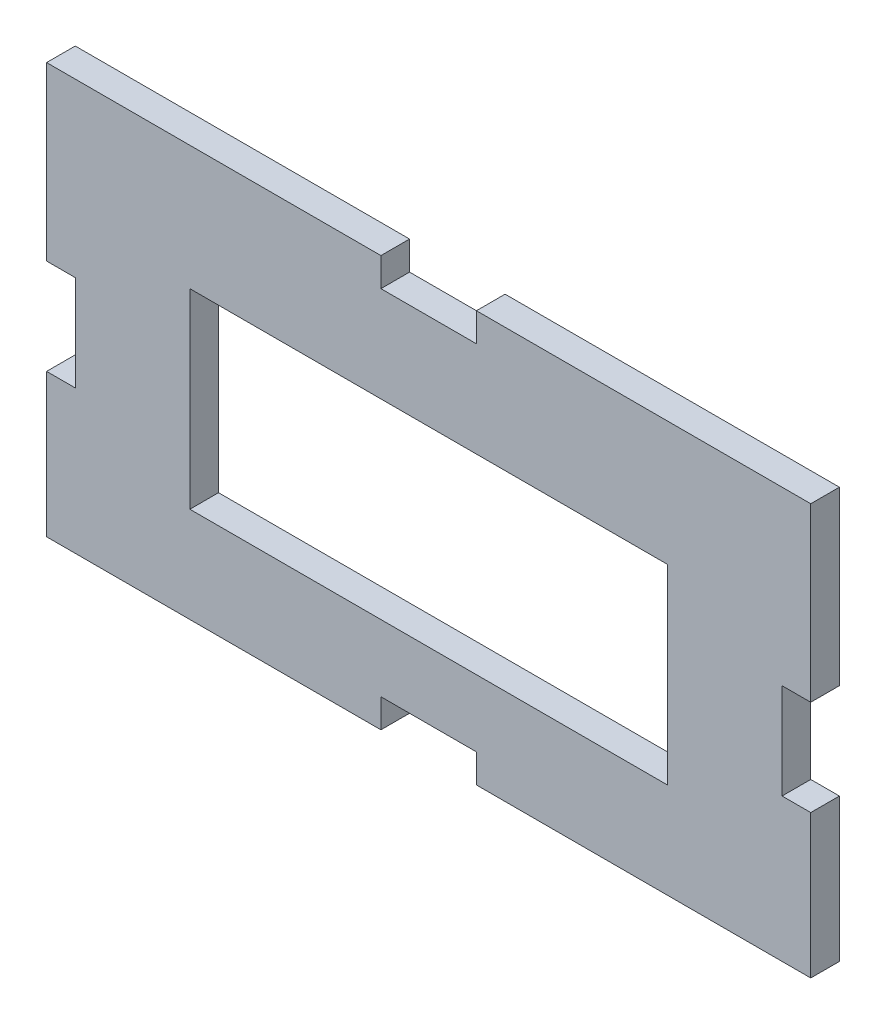
ISO-10303-21;
HEADER;
FILE_DESCRIPTION(('STEP AP214'),'2;1');
FILE_NAME('part.step','',(''),(''),'','','');
FILE_SCHEMA(('AUTOMOTIVE_DESIGN { 1 0 10303 214 1 1 1 1 }'));
ENDSEC;
DATA;
#1=APPLICATION_CONTEXT('core data for automotive mechanical design processes');
#2=APPLICATION_PROTOCOL_DEFINITION('international standard','automotive_design',2000,#1);
#3=PRODUCT_CONTEXT('',#1,'mechanical');
#4=PRODUCT('Part','Part','',(#3));
#5=PRODUCT_RELATED_PRODUCT_CATEGORY('part','',(#4));
#6=PRODUCT_DEFINITION_FORMATION('','',#4);
#7=PRODUCT_DEFINITION_CONTEXT('part definition',#1,'design');
#8=PRODUCT_DEFINITION('design','',#6,#7);
#9=PRODUCT_DEFINITION_SHAPE('','',#8);
#10=(LENGTH_UNIT() NAMED_UNIT(*) SI_UNIT(.MILLI.,.METRE.));
#11=(NAMED_UNIT(*) PLANE_ANGLE_UNIT() SI_UNIT($,.RADIAN.));
#12=(NAMED_UNIT(*) SI_UNIT($,.STERADIAN.) SOLID_ANGLE_UNIT());
#13=UNCERTAINTY_MEASURE_WITH_UNIT(LENGTH_MEASURE(1.E-05),#10,'distance_accuracy_value','');
#14=(GEOMETRIC_REPRESENTATION_CONTEXT(3) GLOBAL_UNCERTAINTY_ASSIGNED_CONTEXT((#13)) GLOBAL_UNIT_ASSIGNED_CONTEXT((#10,
#11,#12)) REPRESENTATION_CONTEXT('',''));
#15=CARTESIAN_POINT('',(0.,0.,0.));
#16=DIRECTION('',(0.,0.,1.));
#17=DIRECTION('',(1.,0.,0.));
#18=AXIS2_PLACEMENT_3D('',#15,#16,#17);
#19=CARTESIAN_POINT('',(-32.6435719058765,-2.13730942666412E-11,3.));
#20=DIRECTION('',(0.,-1.,0.));
#21=DIRECTION('',(0.,0.,-1.));
#22=AXIS2_PLACEMENT_3D('',#19,#20,#21);
#23=PLANE('',#22);
#24=DIRECTION('',(-1.,0.,0.));
#25=VECTOR('',#24,1.);
#26=CARTESIAN_POINT('',(-32.6435719058765,-2.13730942666412E-11,0.));
#27=LINE('',#26,#25);
#28=CARTESIAN_POINT('',(2.35642809412349,-2.13730942666412E-11,0.));
#29=VERTEX_POINT('',#28);
#30=CARTESIAN_POINT('',(-32.6435719058765,-2.13730942666412E-11,0.));
#31=VERTEX_POINT('',#30);
#32=EDGE_CURVE('E222',#29,#31,#27,.T.);
#33=ORIENTED_EDGE('',*,*,#32,.T.);
#34=DIRECTION('',(0.,0.,-1.));
#35=VECTOR('',#34,1.);
#36=CARTESIAN_POINT('',(-32.6435719058765,-2.13730942666412E-11,3.));
#37=LINE('',#36,#35);
#38=CARTESIAN_POINT('',(-32.6435719058765,-2.13730942666412E-11,3.));
#39=VERTEX_POINT('',#38);
#40=EDGE_CURVE('E364',#39,#31,#37,.T.);
#41=ORIENTED_EDGE('',*,*,#40,.F.);
#42=DIRECTION('',(-1.,0.,0.));
#43=VECTOR('',#42,1.);
#44=CARTESIAN_POINT('',(-32.6435719058765,-2.13730942666412E-11,3.));
#45=LINE('',#44,#43);
#46=CARTESIAN_POINT('',(2.35642809412349,-2.13730942666412E-11,3.));
#47=VERTEX_POINT('',#46);
#48=EDGE_CURVE('E225',#47,#39,#45,.T.);
#49=ORIENTED_EDGE('',*,*,#48,.F.);
#50=DIRECTION('',(0.,0.,-1.));
#51=VECTOR('',#50,1.);
#52=CARTESIAN_POINT('',(2.35642809412349,-2.13730942666412E-11,3.));
#53=LINE('',#52,#51);
#54=EDGE_CURVE('E267',#47,#29,#53,.T.);
#55=ORIENTED_EDGE('',*,*,#54,.T.);
#56=EDGE_LOOP('',(#33,#41,#49,#55));
#57=FACE_BOUND('',#56,.T.);
#58=ADVANCED_FACE('F37',(#57),#23,.F.);
#59=CARTESIAN_POINT('',(-32.6435719058765,-2.13730942666412E-11,3.));
#60=DIRECTION('',(1.,0.,0.));
#61=DIRECTION('',(0.,1.,0.));
#62=AXIS2_PLACEMENT_3D('',#59,#60,#61);
#63=PLANE('',#62);
#64=DIRECTION('',(0.,-1.,0.));
#65=VECTOR('',#64,1.);
#66=CARTESIAN_POINT('',(-32.6435719058765,-2.13730942666412E-11,0.));
#67=LINE('',#66,#65);
#68=CARTESIAN_POINT('',(-32.6435719058765,-18.0000000000214,0.));
#69=VERTEX_POINT('',#68);
#70=EDGE_CURVE('E270',#31,#69,#67,.T.);
#71=ORIENTED_EDGE('',*,*,#70,.T.);
#72=DIRECTION('',(0.,0.,-1.));
#73=VECTOR('',#72,1.);
#74=CARTESIAN_POINT('',(-32.6435719058765,-18.0000000000214,3.));
#75=LINE('',#74,#73);
#76=CARTESIAN_POINT('',(-32.6435719058765,-18.0000000000214,3.));
#77=VERTEX_POINT('',#76);
#78=EDGE_CURVE('E361',#77,#69,#75,.T.);
#79=ORIENTED_EDGE('',*,*,#78,.F.);
#80=DIRECTION('',(0.,-1.,0.));
#81=VECTOR('',#80,1.);
#82=CARTESIAN_POINT('',(-32.6435719058765,-2.13730942666412E-11,3.));
#83=LINE('',#82,#81);
#84=EDGE_CURVE('E228',#39,#77,#83,.T.);
#85=ORIENTED_EDGE('',*,*,#84,.F.);
#86=ORIENTED_EDGE('',*,*,#40,.T.);
#87=EDGE_LOOP('',(#71,#79,#85,#86));
#88=FACE_BOUND('',#87,.T.);
#89=ADVANCED_FACE('F390',(#88),#63,.F.);
#90=CARTESIAN_POINT('',(-32.6435719058765,-18.0000000000214,3.));
#91=DIRECTION('',(0.,1.,0.));
#92=DIRECTION('',(0.,0.,1.));
#93=AXIS2_PLACEMENT_3D('',#90,#91,#92);
#94=PLANE('',#93);
#95=DIRECTION('',(1.,0.,0.));
#96=VECTOR('',#95,1.);
#97=CARTESIAN_POINT('',(-32.6435719058765,-18.0000000000214,0.));
#98=LINE('',#97,#96);
#99=CARTESIAN_POINT('',(-29.6435719058765,-18.0000000000214,0.));
#100=VERTEX_POINT('',#99);
#101=EDGE_CURVE('E272',#69,#100,#98,.T.);
#102=ORIENTED_EDGE('',*,*,#101,.T.);
#103=DIRECTION('',(0.,0.,-1.));
#104=VECTOR('',#103,1.);
#105=CARTESIAN_POINT('',(-29.6435719058765,-18.0000000000214,3.));
#106=LINE('',#105,#104);
#107=CARTESIAN_POINT('',(-29.6435719058765,-18.0000000000214,3.));
#108=VERTEX_POINT('',#107);
#109=EDGE_CURVE('E358',#108,#100,#106,.T.);
#110=ORIENTED_EDGE('',*,*,#109,.F.);
#111=DIRECTION('',(1.,0.,0.));
#112=VECTOR('',#111,1.);
#113=CARTESIAN_POINT('',(-32.6435719058765,-18.0000000000214,3.));
#114=LINE('',#113,#112);
#115=EDGE_CURVE('E231',#77,#108,#114,.T.);
#116=ORIENTED_EDGE('',*,*,#115,.F.);
#117=ORIENTED_EDGE('',*,*,#78,.T.);
#118=EDGE_LOOP('',(#102,#110,#116,#117));
#119=FACE_BOUND('',#118,.T.);
#120=ADVANCED_FACE('F395',(#119),#94,.F.);
#121=CARTESIAN_POINT('',(-29.6435719058765,-18.0000000000214,3.));
#122=DIRECTION('',(1.,0.,0.));
#123=DIRECTION('',(0.,0.,-1.));
#124=AXIS2_PLACEMENT_3D('',#121,#122,#123);
#125=PLANE('',#124);
#126=DIRECTION('',(0.,-1.,0.));
#127=VECTOR('',#126,1.);
#128=CARTESIAN_POINT('',(-29.6435719058765,-18.0000000000214,0.));
#129=LINE('',#128,#127);
#130=CARTESIAN_POINT('',(-29.6435719058765,-28.0000000000214,0.));
#131=VERTEX_POINT('',#130);
#132=EDGE_CURVE('E274',#100,#131,#129,.T.);
#133=ORIENTED_EDGE('',*,*,#132,.T.);
#134=DIRECTION('',(0.,0.,-1.));
#135=VECTOR('',#134,1.);
#136=CARTESIAN_POINT('',(-29.6435719058765,-28.0000000000214,3.));
#137=LINE('',#136,#135);
#138=CARTESIAN_POINT('',(-29.6435719058765,-28.0000000000214,3.));
#139=VERTEX_POINT('',#138);
#140=EDGE_CURVE('E355',#139,#131,#137,.T.);
#141=ORIENTED_EDGE('',*,*,#140,.F.);
#142=DIRECTION('',(0.,-1.,0.));
#143=VECTOR('',#142,1.);
#144=CARTESIAN_POINT('',(-29.6435719058765,-18.0000000000214,3.));
#145=LINE('',#144,#143);
#146=EDGE_CURVE('E233',#108,#139,#145,.T.);
#147=ORIENTED_EDGE('',*,*,#146,.F.);
#148=ORIENTED_EDGE('',*,*,#109,.T.);
#149=EDGE_LOOP('',(#133,#141,#147,#148));
#150=FACE_BOUND('',#149,.T.);
#151=ADVANCED_FACE('F485',(#150),#125,.F.);
#152=CARTESIAN_POINT('',(-29.6435719058765,-28.0000000000214,3.));
#153=DIRECTION('',(0.,-1.,0.));
#154=DIRECTION('',(0.,0.,-1.));
#155=AXIS2_PLACEMENT_3D('',#152,#153,#154);
#156=PLANE('',#155);
#157=DIRECTION('',(-1.,0.,0.));
#158=VECTOR('',#157,1.);
#159=CARTESIAN_POINT('',(-29.6435719058765,-28.0000000000214,0.));
#160=LINE('',#159,#158);
#161=CARTESIAN_POINT('',(-32.6435719058765,-28.0000000000214,0.));
#162=VERTEX_POINT('',#161);
#163=EDGE_CURVE('E276',#131,#162,#160,.T.);
#164=ORIENTED_EDGE('',*,*,#163,.T.);
#165=DIRECTION('',(0.,0.,-1.));
#166=VECTOR('',#165,1.);
#167=CARTESIAN_POINT('',(-32.6435719058765,-28.0000000000214,3.));
#168=LINE('',#167,#166);
#169=CARTESIAN_POINT('',(-32.6435719058765,-28.0000000000214,3.));
#170=VERTEX_POINT('',#169);
#171=EDGE_CURVE('E352',#170,#162,#168,.T.);
#172=ORIENTED_EDGE('',*,*,#171,.F.);
#173=DIRECTION('',(-1.,0.,0.));
#174=VECTOR('',#173,1.);
#175=CARTESIAN_POINT('',(-29.6435719058765,-28.0000000000214,3.));
#176=LINE('',#175,#174);
#177=EDGE_CURVE('E235',#139,#170,#176,.T.);
#178=ORIENTED_EDGE('',*,*,#177,.F.);
#179=ORIENTED_EDGE('',*,*,#140,.T.);
#180=EDGE_LOOP('',(#164,#172,#178,#179));
#181=FACE_BOUND('',#180,.T.);
#182=ADVANCED_FACE('F482',(#181),#156,.F.);
#183=CARTESIAN_POINT('',(-32.6435719058765,-28.0000000000214,3.));
#184=DIRECTION('',(1.,0.,0.));
#185=DIRECTION('',(0.,0.,-1.));
#186=AXIS2_PLACEMENT_3D('',#183,#184,#185);
#187=PLANE('',#186);
#188=DIRECTION('',(0.,-1.,0.));
#189=VECTOR('',#188,1.);
#190=CARTESIAN_POINT('',(-32.6435719058765,-28.0000000000214,0.));
#191=LINE('',#190,#189);
#192=CARTESIAN_POINT('',(-32.6435719058765,-43.0000000000214,0.));
#193=VERTEX_POINT('',#192);
#194=EDGE_CURVE('E278',#162,#193,#191,.T.);
#195=ORIENTED_EDGE('',*,*,#194,.T.);
#196=DIRECTION('',(0.,0.,-1.));
#197=VECTOR('',#196,1.);
#198=CARTESIAN_POINT('',(-32.6435719058765,-43.0000000000214,3.));
#199=LINE('',#198,#197);
#200=CARTESIAN_POINT('',(-32.6435719058765,-43.0000000000214,3.));
#201=VERTEX_POINT('',#200);
#202=EDGE_CURVE('E349',#201,#193,#199,.T.);
#203=ORIENTED_EDGE('',*,*,#202,.F.);
#204=DIRECTION('',(0.,-1.,0.));
#205=VECTOR('',#204,1.);
#206=CARTESIAN_POINT('',(-32.6435719058765,-28.0000000000214,3.));
#207=LINE('',#206,#205);
#208=EDGE_CURVE('E237',#170,#201,#207,.T.);
#209=ORIENTED_EDGE('',*,*,#208,.F.);
#210=ORIENTED_EDGE('',*,*,#171,.T.);
#211=EDGE_LOOP('',(#195,#203,#209,#210));
#212=FACE_BOUND('',#211,.T.);
#213=ADVANCED_FACE('F478',(#212),#187,.F.);
#214=CARTESIAN_POINT('',(-32.6435719058765,-43.0000000000214,3.));
#215=DIRECTION('',(0.,1.,0.));
#216=DIRECTION('',(0.,0.,1.));
#217=AXIS2_PLACEMENT_3D('',#214,#215,#216);
#218=PLANE('',#217);
#219=DIRECTION('',(1.,0.,0.));
#220=VECTOR('',#219,1.);
#221=CARTESIAN_POINT('',(-32.6435719058765,-43.0000000000214,0.));
#222=LINE('',#221,#220);
#223=CARTESIAN_POINT('',(2.35642809412349,-43.0000000000214,0.));
#224=VERTEX_POINT('',#223);
#225=EDGE_CURVE('E280',#193,#224,#222,.T.);
#226=ORIENTED_EDGE('',*,*,#225,.T.);
#227=DIRECTION('',(0.,0.,-1.));
#228=VECTOR('',#227,1.);
#229=CARTESIAN_POINT('',(2.35642809412349,-43.0000000000214,3.));
#230=LINE('',#229,#228);
#231=CARTESIAN_POINT('',(2.35642809412349,-43.0000000000214,3.));
#232=VERTEX_POINT('',#231);
#233=EDGE_CURVE('E346',#232,#224,#230,.T.);
#234=ORIENTED_EDGE('',*,*,#233,.F.);
#235=DIRECTION('',(1.,0.,0.));
#236=VECTOR('',#235,1.);
#237=CARTESIAN_POINT('',(-32.6435719058765,-43.0000000000214,3.));
#238=LINE('',#237,#236);
#239=EDGE_CURVE('E239',#201,#232,#238,.T.);
#240=ORIENTED_EDGE('',*,*,#239,.F.);
#241=ORIENTED_EDGE('',*,*,#202,.T.);
#242=EDGE_LOOP('',(#226,#234,#240,#241));
#243=FACE_BOUND('',#242,.T.);
#244=ADVANCED_FACE('F473',(#243),#218,.F.);
#245=CARTESIAN_POINT('',(2.35642809412349,-43.0000000000214,3.));
#246=DIRECTION('',(-1.,0.,0.));
#247=DIRECTION('',(0.,-1.,0.));
#248=AXIS2_PLACEMENT_3D('',#245,#246,#247);
#249=PLANE('',#248);
#250=DIRECTION('',(0.,1.,0.));
#251=VECTOR('',#250,1.);
#252=CARTESIAN_POINT('',(2.35642809412349,-43.0000000000214,0.));
#253=LINE('',#252,#251);
#254=CARTESIAN_POINT('',(2.35642809412349,-40.0000000000214,0.));
#255=VERTEX_POINT('',#254);
#256=EDGE_CURVE('E282',#224,#255,#253,.T.);
#257=ORIENTED_EDGE('',*,*,#256,.T.);
#258=DIRECTION('',(0.,0.,-1.));
#259=VECTOR('',#258,1.);
#260=CARTESIAN_POINT('',(2.35642809412349,-40.0000000000214,3.));
#261=LINE('',#260,#259);
#262=CARTESIAN_POINT('',(2.35642809412349,-40.0000000000214,3.));
#263=VERTEX_POINT('',#262);
#264=EDGE_CURVE('E343',#263,#255,#261,.T.);
#265=ORIENTED_EDGE('',*,*,#264,.F.);
#266=DIRECTION('',(0.,1.,0.));
#267=VECTOR('',#266,1.);
#268=CARTESIAN_POINT('',(2.35642809412349,-43.0000000000214,3.));
#269=LINE('',#268,#267);
#270=EDGE_CURVE('E241',#232,#263,#269,.T.);
#271=ORIENTED_EDGE('',*,*,#270,.F.);
#272=ORIENTED_EDGE('',*,*,#233,.T.);
#273=EDGE_LOOP('',(#257,#265,#271,#272));
#274=FACE_BOUND('',#273,.T.);
#275=ADVANCED_FACE('F467',(#274),#249,.F.);
#276=CARTESIAN_POINT('',(2.35642809412349,-40.0000000000214,3.));
#277=DIRECTION('',(0.,1.,0.));
#278=DIRECTION('',(0.,0.,1.));
#279=AXIS2_PLACEMENT_3D('',#276,#277,#278);
#280=PLANE('',#279);
#281=DIRECTION('',(1.,0.,0.));
#282=VECTOR('',#281,1.);
#283=CARTESIAN_POINT('',(2.35642809412349,-40.0000000000214,0.));
#284=LINE('',#283,#282);
#285=CARTESIAN_POINT('',(12.3564280941235,-40.0000000000214,0.));
#286=VERTEX_POINT('',#285);
#287=EDGE_CURVE('E284',#255,#286,#284,.T.);
#288=ORIENTED_EDGE('',*,*,#287,.T.);
#289=DIRECTION('',(0.,0.,-1.));
#290=VECTOR('',#289,1.);
#291=CARTESIAN_POINT('',(12.3564280941235,-40.0000000000214,3.));
#292=LINE('',#291,#290);
#293=CARTESIAN_POINT('',(12.3564280941235,-40.0000000000214,3.));
#294=VERTEX_POINT('',#293);
#295=EDGE_CURVE('E340',#294,#286,#292,.T.);
#296=ORIENTED_EDGE('',*,*,#295,.F.);
#297=DIRECTION('',(1.,0.,0.));
#298=VECTOR('',#297,1.);
#299=CARTESIAN_POINT('',(2.35642809412349,-40.0000000000214,3.));
#300=LINE('',#299,#298);
#301=EDGE_CURVE('E243',#263,#294,#300,.T.);
#302=ORIENTED_EDGE('',*,*,#301,.F.);
#303=ORIENTED_EDGE('',*,*,#264,.T.);
#304=EDGE_LOOP('',(#288,#296,#302,#303));
#305=FACE_BOUND('',#304,.T.);
#306=ADVANCED_FACE('F463',(#305),#280,.F.);
#307=CARTESIAN_POINT('',(12.3564280941235,-43.0000000000214,3.));
#308=DIRECTION('',(1.,0.,0.));
#309=DIRECTION('',(0.,1.,0.));
#310=AXIS2_PLACEMENT_3D('',#307,#308,#309);
#311=PLANE('',#310);
#312=DIRECTION('',(0.,-1.,0.));
#313=VECTOR('',#312,1.);
#314=CARTESIAN_POINT('',(12.3564280941235,-43.0000000000214,0.));
#315=LINE('',#314,#313);
#316=CARTESIAN_POINT('',(12.3564280941235,-43.0000000000214,0.));
#317=VERTEX_POINT('',#316);
#318=EDGE_CURVE('E286',#286,#317,#315,.T.);
#319=ORIENTED_EDGE('',*,*,#318,.T.);
#320=DIRECTION('',(0.,0.,-1.));
#321=VECTOR('',#320,1.);
#322=CARTESIAN_POINT('',(12.3564280941235,-43.0000000000214,3.));
#323=LINE('',#322,#321);
#324=CARTESIAN_POINT('',(12.3564280941235,-43.0000000000214,3.));
#325=VERTEX_POINT('',#324);
#326=EDGE_CURVE('E337',#325,#317,#323,.T.);
#327=ORIENTED_EDGE('',*,*,#326,.F.);
#328=DIRECTION('',(0.,-1.,0.));
#329=VECTOR('',#328,1.);
#330=CARTESIAN_POINT('',(12.3564280941235,-43.0000000000214,3.));
#331=LINE('',#330,#329);
#332=EDGE_CURVE('E245',#294,#325,#331,.T.);
#333=ORIENTED_EDGE('',*,*,#332,.F.);
#334=ORIENTED_EDGE('',*,*,#295,.T.);
#335=EDGE_LOOP('',(#319,#327,#333,#334));
#336=FACE_BOUND('',#335,.T.);
#337=ADVANCED_FACE('F458',(#336),#311,.F.);
#338=CARTESIAN_POINT('',(12.3564280941235,-43.0000000000214,3.));
#339=DIRECTION('',(0.,1.,0.));
#340=DIRECTION('',(0.,0.,1.));
#341=AXIS2_PLACEMENT_3D('',#338,#339,#340);
#342=PLANE('',#341);
#343=DIRECTION('',(1.,0.,0.));
#344=VECTOR('',#343,1.);
#345=CARTESIAN_POINT('',(12.3564280941235,-43.0000000000214,0.));
#346=LINE('',#345,#344);
#347=CARTESIAN_POINT('',(47.3564280941235,-43.0000000000214,0.));
#348=VERTEX_POINT('',#347);
#349=EDGE_CURVE('E288',#317,#348,#346,.T.);
#350=ORIENTED_EDGE('',*,*,#349,.T.);
#351=DIRECTION('',(0.,0.,-1.));
#352=VECTOR('',#351,1.);
#353=CARTESIAN_POINT('',(47.3564280941235,-43.0000000000214,3.));
#354=LINE('',#353,#352);
#355=CARTESIAN_POINT('',(47.3564280941235,-43.0000000000214,3.));
#356=VERTEX_POINT('',#355);
#357=EDGE_CURVE('E334',#356,#348,#354,.T.);
#358=ORIENTED_EDGE('',*,*,#357,.F.);
#359=DIRECTION('',(1.,0.,0.));
#360=VECTOR('',#359,1.);
#361=CARTESIAN_POINT('',(12.3564280941235,-43.0000000000214,3.));
#362=LINE('',#361,#360);
#363=EDGE_CURVE('E247',#325,#356,#362,.T.);
#364=ORIENTED_EDGE('',*,*,#363,.F.);
#365=ORIENTED_EDGE('',*,*,#326,.T.);
#366=EDGE_LOOP('',(#350,#358,#364,#365));
#367=FACE_BOUND('',#366,.T.);
#368=ADVANCED_FACE('F452',(#367),#342,.F.);
#369=CARTESIAN_POINT('',(47.3564280941235,-43.0000000000214,3.));
#370=DIRECTION('',(-1.,0.,0.));
#371=DIRECTION('',(0.,0.,1.));
#372=AXIS2_PLACEMENT_3D('',#369,#370,#371);
#373=PLANE('',#372);
#374=DIRECTION('',(0.,1.,0.));
#375=VECTOR('',#374,1.);
#376=CARTESIAN_POINT('',(47.3564280941235,-43.0000000000214,0.));
#377=LINE('',#376,#375);
#378=CARTESIAN_POINT('',(47.3564280941235,-28.0000000000214,0.));
#379=VERTEX_POINT('',#378);
#380=EDGE_CURVE('E290',#348,#379,#377,.T.);
#381=ORIENTED_EDGE('',*,*,#380,.T.);
#382=DIRECTION('',(0.,0.,-1.));
#383=VECTOR('',#382,1.);
#384=CARTESIAN_POINT('',(47.3564280941235,-28.0000000000214,3.));
#385=LINE('',#384,#383);
#386=CARTESIAN_POINT('',(47.3564280941235,-28.0000000000214,3.));
#387=VERTEX_POINT('',#386);
#388=EDGE_CURVE('E331',#387,#379,#385,.T.);
#389=ORIENTED_EDGE('',*,*,#388,.F.);
#390=DIRECTION('',(0.,1.,0.));
#391=VECTOR('',#390,1.);
#392=CARTESIAN_POINT('',(47.3564280941235,-43.0000000000214,3.));
#393=LINE('',#392,#391);
#394=EDGE_CURVE('E249',#356,#387,#393,.T.);
#395=ORIENTED_EDGE('',*,*,#394,.F.);
#396=ORIENTED_EDGE('',*,*,#357,.T.);
#397=EDGE_LOOP('',(#381,#389,#395,#396));
#398=FACE_BOUND('',#397,.T.);
#399=ADVANCED_FACE('F448',(#398),#373,.F.);
#400=CARTESIAN_POINT('',(47.3564280941235,-28.0000000000214,3.));
#401=DIRECTION('',(0.,-1.,0.));
#402=DIRECTION('',(0.,0.,-1.));
#403=AXIS2_PLACEMENT_3D('',#400,#401,#402);
#404=PLANE('',#403);
#405=DIRECTION('',(-1.,0.,0.));
#406=VECTOR('',#405,1.);
#407=CARTESIAN_POINT('',(47.3564280941235,-28.0000000000214,0.));
#408=LINE('',#407,#406);
#409=CARTESIAN_POINT('',(44.3564280941235,-28.0000000000214,0.));
#410=VERTEX_POINT('',#409);
#411=EDGE_CURVE('E292',#379,#410,#408,.T.);
#412=ORIENTED_EDGE('',*,*,#411,.T.);
#413=DIRECTION('',(0.,0.,-1.));
#414=VECTOR('',#413,1.);
#415=CARTESIAN_POINT('',(44.3564280941235,-28.0000000000214,3.));
#416=LINE('',#415,#414);
#417=CARTESIAN_POINT('',(44.3564280941235,-28.0000000000214,3.));
#418=VERTEX_POINT('',#417);
#419=EDGE_CURVE('E328',#418,#410,#416,.T.);
#420=ORIENTED_EDGE('',*,*,#419,.F.);
#421=DIRECTION('',(-1.,0.,0.));
#422=VECTOR('',#421,1.);
#423=CARTESIAN_POINT('',(47.3564280941235,-28.0000000000214,3.));
#424=LINE('',#423,#422);
#425=EDGE_CURVE('E251',#387,#418,#424,.T.);
#426=ORIENTED_EDGE('',*,*,#425,.F.);
#427=ORIENTED_EDGE('',*,*,#388,.T.);
#428=EDGE_LOOP('',(#412,#420,#426,#427));
#429=FACE_BOUND('',#428,.T.);
#430=ADVANCED_FACE('F443',(#429),#404,.F.);
#431=CARTESIAN_POINT('',(44.3564280941235,-28.0000000000214,3.));
#432=DIRECTION('',(-1.,0.,0.));
#433=DIRECTION('',(0.,0.,1.));
#434=AXIS2_PLACEMENT_3D('',#431,#432,#433);
#435=PLANE('',#434);
#436=DIRECTION('',(0.,1.,0.));
#437=VECTOR('',#436,1.);
#438=CARTESIAN_POINT('',(44.3564280941235,-28.0000000000214,0.));
#439=LINE('',#438,#437);
#440=CARTESIAN_POINT('',(44.3564280941235,-18.0000000000214,0.));
#441=VERTEX_POINT('',#440);
#442=EDGE_CURVE('E294',#410,#441,#439,.T.);
#443=ORIENTED_EDGE('',*,*,#442,.T.);
#444=DIRECTION('',(0.,0.,-1.));
#445=VECTOR('',#444,1.);
#446=CARTESIAN_POINT('',(44.3564280941235,-18.0000000000214,3.));
#447=LINE('',#446,#445);
#448=CARTESIAN_POINT('',(44.3564280941235,-18.0000000000214,3.));
#449=VERTEX_POINT('',#448);
#450=EDGE_CURVE('E325',#449,#441,#447,.T.);
#451=ORIENTED_EDGE('',*,*,#450,.F.);
#452=DIRECTION('',(0.,1.,0.));
#453=VECTOR('',#452,1.);
#454=CARTESIAN_POINT('',(44.3564280941235,-28.0000000000214,3.));
#455=LINE('',#454,#453);
#456=EDGE_CURVE('E253',#418,#449,#455,.T.);
#457=ORIENTED_EDGE('',*,*,#456,.F.);
#458=ORIENTED_EDGE('',*,*,#419,.T.);
#459=EDGE_LOOP('',(#443,#451,#457,#458));
#460=FACE_BOUND('',#459,.T.);
#461=ADVANCED_FACE('F437',(#460),#435,.F.);
#462=CARTESIAN_POINT('',(44.3564280941235,-18.0000000000214,3.));
#463=DIRECTION('',(0.,1.,0.));
#464=DIRECTION('',(0.,0.,1.));
#465=AXIS2_PLACEMENT_3D('',#462,#463,#464);
#466=PLANE('',#465);
#467=DIRECTION('',(1.,0.,0.));
#468=VECTOR('',#467,1.);
#469=CARTESIAN_POINT('',(44.3564280941235,-18.0000000000214,0.));
#470=LINE('',#469,#468);
#471=CARTESIAN_POINT('',(47.3564280941235,-18.0000000000214,0.));
#472=VERTEX_POINT('',#471);
#473=EDGE_CURVE('E296',#441,#472,#470,.T.);
#474=ORIENTED_EDGE('',*,*,#473,.T.);
#475=DIRECTION('',(0.,0.,-1.));
#476=VECTOR('',#475,1.);
#477=CARTESIAN_POINT('',(47.3564280941235,-18.0000000000214,3.));
#478=LINE('',#477,#476);
#479=CARTESIAN_POINT('',(47.3564280941235,-18.0000000000214,3.));
#480=VERTEX_POINT('',#479);
#481=EDGE_CURVE('E322',#480,#472,#478,.T.);
#482=ORIENTED_EDGE('',*,*,#481,.F.);
#483=DIRECTION('',(1.,0.,0.));
#484=VECTOR('',#483,1.);
#485=CARTESIAN_POINT('',(44.3564280941235,-18.0000000000214,3.));
#486=LINE('',#485,#484);
#487=EDGE_CURVE('E255',#449,#480,#486,.T.);
#488=ORIENTED_EDGE('',*,*,#487,.F.);
#489=ORIENTED_EDGE('',*,*,#450,.T.);
#490=EDGE_LOOP('',(#474,#482,#488,#489));
#491=FACE_BOUND('',#490,.T.);
#492=ADVANCED_FACE('F432',(#491),#466,.F.);
#493=CARTESIAN_POINT('',(47.3564280941235,-2.13730942666412E-11,3.));
#494=DIRECTION('',(-1.,0.,0.));
#495=DIRECTION('',(0.,0.,1.));
#496=AXIS2_PLACEMENT_3D('',#493,#494,#495);
#497=PLANE('',#496);
#498=DIRECTION('',(0.,1.,0.));
#499=VECTOR('',#498,1.);
#500=CARTESIAN_POINT('',(47.3564280941235,-2.13730942666412E-11,0.));
#501=LINE('',#500,#499);
#502=CARTESIAN_POINT('',(47.3564280941235,-2.13730942666412E-11,0.));
#503=VERTEX_POINT('',#502);
#504=EDGE_CURVE('E299',#472,#503,#501,.T.);
#505=ORIENTED_EDGE('',*,*,#504,.T.);
#506=DIRECTION('',(0.,0.,-1.));
#507=VECTOR('',#506,1.);
#508=CARTESIAN_POINT('',(47.3564280941235,-2.13730942666412E-11,3.));
#509=LINE('',#508,#507);
#510=CARTESIAN_POINT('',(47.3564280941235,-2.13730942666412E-11,3.));
#511=VERTEX_POINT('',#510);
#512=EDGE_CURVE('E319',#511,#503,#509,.T.);
#513=ORIENTED_EDGE('',*,*,#512,.F.);
#514=DIRECTION('',(0.,1.,0.));
#515=VECTOR('',#514,1.);
#516=CARTESIAN_POINT('',(47.3564280941235,-18.0000000000214,3.));
#517=LINE('',#516,#515);
#518=EDGE_CURVE('E257',#480,#511,#517,.T.);
#519=ORIENTED_EDGE('',*,*,#518,.F.);
#520=ORIENTED_EDGE('',*,*,#481,.T.);
#521=EDGE_LOOP('',(#505,#513,#519,#520));
#522=FACE_BOUND('',#521,.T.);
#523=ADVANCED_FACE('F427',(#522),#497,.F.);
#524=CARTESIAN_POINT('',(12.3564280941235,-2.13730942666412E-11,3.));
#525=DIRECTION('',(0.,-1.,0.));
#526=DIRECTION('',(0.,0.,-1.));
#527=AXIS2_PLACEMENT_3D('',#524,#525,#526);
#528=PLANE('',#527);
#529=DIRECTION('',(-1.,0.,0.));
#530=VECTOR('',#529,1.);
#531=CARTESIAN_POINT('',(12.3564280941235,-2.13730942666412E-11,0.));
#532=LINE('',#531,#530);
#533=CARTESIAN_POINT('',(12.3564280941235,-2.13730942666412E-11,0.));
#534=VERTEX_POINT('',#533);
#535=EDGE_CURVE('E301',#503,#534,#532,.T.);
#536=ORIENTED_EDGE('',*,*,#535,.T.);
#537=DIRECTION('',(0.,0.,-1.));
#538=VECTOR('',#537,1.);
#539=CARTESIAN_POINT('',(12.3564280941235,-2.13730942666412E-11,3.));
#540=LINE('',#539,#538);
#541=CARTESIAN_POINT('',(12.3564280941235,-2.13730942666412E-11,3.));
#542=VERTEX_POINT('',#541);
#543=EDGE_CURVE('E316',#542,#534,#540,.T.);
#544=ORIENTED_EDGE('',*,*,#543,.F.);
#545=DIRECTION('',(-1.,0.,0.));
#546=VECTOR('',#545,1.);
#547=CARTESIAN_POINT('',(12.3564280941235,-2.13730942666412E-11,3.));
#548=LINE('',#547,#546);
#549=EDGE_CURVE('E259',#511,#542,#548,.T.);
#550=ORIENTED_EDGE('',*,*,#549,.F.);
#551=ORIENTED_EDGE('',*,*,#512,.T.);
#552=EDGE_LOOP('',(#536,#544,#550,#551));
#553=FACE_BOUND('',#552,.T.);
#554=ADVANCED_FACE('F423',(#553),#528,.F.);
#555=CARTESIAN_POINT('',(12.3564280941235,-3.00000000002137,3.));
#556=DIRECTION('',(1.,0.,0.));
#557=DIRECTION('',(0.,1.,0.));
#558=AXIS2_PLACEMENT_3D('',#555,#556,#557);
#559=PLANE('',#558);
#560=DIRECTION('',(0.,-1.,0.));
#561=VECTOR('',#560,1.);
#562=CARTESIAN_POINT('',(12.3564280941235,-3.00000000002137,0.));
#563=LINE('',#562,#561);
#564=CARTESIAN_POINT('',(12.3564280941235,-3.00000000002137,0.));
#565=VERTEX_POINT('',#564);
#566=EDGE_CURVE('E303',#534,#565,#563,.T.);
#567=ORIENTED_EDGE('',*,*,#566,.T.);
#568=DIRECTION('',(0.,0.,-1.));
#569=VECTOR('',#568,1.);
#570=CARTESIAN_POINT('',(12.3564280941235,-3.00000000002137,3.));
#571=LINE('',#570,#569);
#572=CARTESIAN_POINT('',(12.3564280941235,-3.00000000002137,3.));
#573=VERTEX_POINT('',#572);
#574=EDGE_CURVE('E313',#573,#565,#571,.T.);
#575=ORIENTED_EDGE('',*,*,#574,.F.);
#576=DIRECTION('',(0.,-1.,0.));
#577=VECTOR('',#576,1.);
#578=CARTESIAN_POINT('',(12.3564280941235,-3.00000000002137,3.));
#579=LINE('',#578,#577);
#580=EDGE_CURVE('E261',#542,#573,#579,.T.);
#581=ORIENTED_EDGE('',*,*,#580,.F.);
#582=ORIENTED_EDGE('',*,*,#543,.T.);
#583=EDGE_LOOP('',(#567,#575,#581,#582));
#584=FACE_BOUND('',#583,.T.);
#585=ADVANCED_FACE('F418',(#584),#559,.F.);
#586=CARTESIAN_POINT('',(2.35642809412349,-3.00000000002137,3.));
#587=DIRECTION('',(0.,-1.,0.));
#588=DIRECTION('',(0.,0.,-1.));
#589=AXIS2_PLACEMENT_3D('',#586,#587,#588);
#590=PLANE('',#589);
#591=DIRECTION('',(-1.,0.,0.));
#592=VECTOR('',#591,1.);
#593=CARTESIAN_POINT('',(2.35642809412349,-3.00000000002137,0.));
#594=LINE('',#593,#592);
#595=CARTESIAN_POINT('',(2.35642809412349,-3.00000000002137,0.));
#596=VERTEX_POINT('',#595);
#597=EDGE_CURVE('E305',#565,#596,#594,.T.);
#598=ORIENTED_EDGE('',*,*,#597,.T.);
#599=DIRECTION('',(0.,0.,-1.));
#600=VECTOR('',#599,1.);
#601=CARTESIAN_POINT('',(2.35642809412349,-3.00000000002137,3.));
#602=LINE('',#601,#600);
#603=CARTESIAN_POINT('',(2.35642809412349,-3.00000000002137,3.));
#604=VERTEX_POINT('',#603);
#605=EDGE_CURVE('E310',#604,#596,#602,.T.);
#606=ORIENTED_EDGE('',*,*,#605,.F.);
#607=DIRECTION('',(-1.,0.,0.));
#608=VECTOR('',#607,1.);
#609=CARTESIAN_POINT('',(2.35642809412349,-3.00000000002137,3.));
#610=LINE('',#609,#608);
#611=EDGE_CURVE('E263',#573,#604,#610,.T.);
#612=ORIENTED_EDGE('',*,*,#611,.F.);
#613=ORIENTED_EDGE('',*,*,#574,.T.);
#614=EDGE_LOOP('',(#598,#606,#612,#613));
#615=FACE_BOUND('',#614,.T.);
#616=ADVANCED_FACE('F413',(#615),#590,.F.);
#617=CARTESIAN_POINT('',(2.35642809412349,-2.13730942666412E-11,3.));
#618=DIRECTION('',(-1.,0.,0.));
#619=DIRECTION('',(0.,0.,1.));
#620=AXIS2_PLACEMENT_3D('',#617,#618,#619);
#621=PLANE('',#620);
#622=DIRECTION('',(0.,1.,0.));
#623=VECTOR('',#622,1.);
#624=CARTESIAN_POINT('',(2.35642809412349,-2.13730942666412E-11,0.));
#625=LINE('',#624,#623);
#626=EDGE_CURVE('E229',#596,#29,#625,.T.);
#627=ORIENTED_EDGE('',*,*,#626,.T.);
#628=ORIENTED_EDGE('',*,*,#54,.F.);
#629=DIRECTION('',(0.,1.,0.));
#630=VECTOR('',#629,1.);
#631=CARTESIAN_POINT('',(2.35642809412349,-2.13730942666412E-11,3.));
#632=LINE('',#631,#630);
#633=EDGE_CURVE('E265',#604,#47,#632,.T.);
#634=ORIENTED_EDGE('',*,*,#633,.F.);
#635=ORIENTED_EDGE('',*,*,#605,.T.);
#636=EDGE_LOOP('',(#627,#628,#634,#635));
#637=FACE_BOUND('',#636,.T.);
#638=ADVANCED_FACE('F411',(#637),#621,.F.);
#639=CARTESIAN_POINT('',(0.,0.,3.));
#640=DIRECTION('',(0.,0.,-1.));
#641=DIRECTION('',(-1.,0.,0.));
#642=AXIS2_PLACEMENT_3D('',#639,#640,#641);
#643=PLANE('',#642);
#644=DIRECTION('',(-1.,0.,0.));
#645=VECTOR('',#644,1.);
#646=CARTESIAN_POINT('',(-17.6435719058765,-13.0000000000214,3.));
#647=LINE('',#646,#645);
#648=CARTESIAN_POINT('',(32.3564280941235,-13.0000000000214,3.));
#649=VERTEX_POINT('',#648);
#650=CARTESIAN_POINT('',(-17.6435719058765,-13.0000000000214,3.));
#651=VERTEX_POINT('',#650);
#652=EDGE_CURVE('E208',#649,#651,#647,.T.);
#653=ORIENTED_EDGE('',*,*,#652,.F.);
#654=DIRECTION('',(0.,1.,0.));
#655=VECTOR('',#654,1.);
#656=CARTESIAN_POINT('',(32.3564280941235,-33.0000000000214,3.));
#657=LINE('',#656,#655);
#658=CARTESIAN_POINT('',(32.3564280941235,-33.0000000000214,3.));
#659=VERTEX_POINT('',#658);
#660=EDGE_CURVE('E51',#659,#649,#657,.T.);
#661=ORIENTED_EDGE('',*,*,#660,.F.);
#662=DIRECTION('',(1.,0.,0.));
#663=VECTOR('',#662,1.);
#664=CARTESIAN_POINT('',(-17.6435719058765,-33.0000000000214,3.));
#665=LINE('',#664,#663);
#666=CARTESIAN_POINT('',(-17.6435719058765,-33.0000000000214,3.));
#667=VERTEX_POINT('',#666);
#668=EDGE_CURVE('E215',#667,#659,#665,.T.);
#669=ORIENTED_EDGE('',*,*,#668,.F.);
#670=DIRECTION('',(0.,-1.,0.));
#671=VECTOR('',#670,1.);
#672=CARTESIAN_POINT('',(-17.6435719058765,-33.0000000000214,3.));
#673=LINE('',#672,#671);
#674=EDGE_CURVE('E199',#651,#667,#673,.T.);
#675=ORIENTED_EDGE('',*,*,#674,.F.);
#676=EDGE_LOOP('',(#653,#661,#669,#675));
#677=FACE_BOUND('',#676,.T.);
#678=ORIENTED_EDGE('',*,*,#48,.T.);
#679=ORIENTED_EDGE('',*,*,#84,.T.);
#680=ORIENTED_EDGE('',*,*,#115,.T.);
#681=ORIENTED_EDGE('',*,*,#146,.T.);
#682=ORIENTED_EDGE('',*,*,#177,.T.);
#683=ORIENTED_EDGE('',*,*,#208,.T.);
#684=ORIENTED_EDGE('',*,*,#239,.T.);
#685=ORIENTED_EDGE('',*,*,#270,.T.);
#686=ORIENTED_EDGE('',*,*,#301,.T.);
#687=ORIENTED_EDGE('',*,*,#332,.T.);
#688=ORIENTED_EDGE('',*,*,#363,.T.);
#689=ORIENTED_EDGE('',*,*,#394,.T.);
#690=ORIENTED_EDGE('',*,*,#425,.T.);
#691=ORIENTED_EDGE('',*,*,#456,.T.);
#692=ORIENTED_EDGE('',*,*,#487,.T.);
#693=ORIENTED_EDGE('',*,*,#518,.T.);
#694=ORIENTED_EDGE('',*,*,#549,.T.);
#695=ORIENTED_EDGE('',*,*,#580,.T.);
#696=ORIENTED_EDGE('',*,*,#611,.T.);
#697=ORIENTED_EDGE('',*,*,#633,.T.);
#698=EDGE_LOOP('',(#678,#679,#680,#681,#682,#683,#684,#685,#686,#687,#688,#689,#690,#691,#692,
#693,#694,#695,#696,#697));
#699=FACE_BOUND('',#698,.T.);
#700=ADVANCED_FACE('F212',(#677,#699),#643,.F.);
#701=CARTESIAN_POINT('',(0.,0.,0.));
#702=DIRECTION('',(0.,0.,-1.));
#703=DIRECTION('',(-1.,0.,0.));
#704=AXIS2_PLACEMENT_3D('',#701,#702,#703);
#705=PLANE('',#704);
#706=DIRECTION('',(0.,-1.,0.));
#707=VECTOR('',#706,1.);
#708=CARTESIAN_POINT('',(32.3564280941235,0.,0.));
#709=LINE('',#708,#707);
#710=CARTESIAN_POINT('',(32.3564280941235,-13.0000000000214,0.));
#711=VERTEX_POINT('',#710);
#712=CARTESIAN_POINT('',(32.3564280941235,-33.0000000000214,0.));
#713=VERTEX_POINT('',#712);
#714=EDGE_CURVE('E11',#711,#713,#709,.T.);
#715=ORIENTED_EDGE('',*,*,#714,.F.);
#716=DIRECTION('',(1.,0.,0.));
#717=VECTOR('',#716,1.);
#718=CARTESIAN_POINT('',(0.,-13.0000000000214,0.));
#719=LINE('',#718,#717);
#720=CARTESIAN_POINT('',(-17.6435719058765,-13.0000000000214,0.));
#721=VERTEX_POINT('',#720);
#722=EDGE_CURVE('E367',#721,#711,#719,.T.);
#723=ORIENTED_EDGE('',*,*,#722,.F.);
#724=DIRECTION('',(0.,1.,0.));
#725=VECTOR('',#724,1.);
#726=CARTESIAN_POINT('',(-17.6435719058765,0.,0.));
#727=LINE('',#726,#725);
#728=CARTESIAN_POINT('',(-17.6435719058765,-33.0000000000214,0.));
#729=VERTEX_POINT('',#728);
#730=EDGE_CURVE('E202',#729,#721,#727,.T.);
#731=ORIENTED_EDGE('',*,*,#730,.F.);
#732=DIRECTION('',(-1.,0.,0.));
#733=VECTOR('',#732,1.);
#734=CARTESIAN_POINT('',(0.,-33.0000000000214,0.));
#735=LINE('',#734,#733);
#736=EDGE_CURVE('E44',#713,#729,#735,.T.);
#737=ORIENTED_EDGE('',*,*,#736,.F.);
#738=EDGE_LOOP('',(#715,#723,#731,#737));
#739=FACE_BOUND('',#738,.T.);
#740=ORIENTED_EDGE('',*,*,#32,.F.);
#741=ORIENTED_EDGE('',*,*,#626,.F.);
#742=ORIENTED_EDGE('',*,*,#597,.F.);
#743=ORIENTED_EDGE('',*,*,#566,.F.);
#744=ORIENTED_EDGE('',*,*,#535,.F.);
#745=ORIENTED_EDGE('',*,*,#504,.F.);
#746=ORIENTED_EDGE('',*,*,#473,.F.);
#747=ORIENTED_EDGE('',*,*,#442,.F.);
#748=ORIENTED_EDGE('',*,*,#411,.F.);
#749=ORIENTED_EDGE('',*,*,#380,.F.);
#750=ORIENTED_EDGE('',*,*,#349,.F.);
#751=ORIENTED_EDGE('',*,*,#318,.F.);
#752=ORIENTED_EDGE('',*,*,#287,.F.);
#753=ORIENTED_EDGE('',*,*,#256,.F.);
#754=ORIENTED_EDGE('',*,*,#225,.F.);
#755=ORIENTED_EDGE('',*,*,#194,.F.);
#756=ORIENTED_EDGE('',*,*,#163,.F.);
#757=ORIENTED_EDGE('',*,*,#132,.F.);
#758=ORIENTED_EDGE('',*,*,#101,.F.);
#759=ORIENTED_EDGE('',*,*,#70,.F.);
#760=EDGE_LOOP('',(#740,#741,#742,#743,#744,#745,#746,#747,#748,#749,#750,#751,#752,#753,#754,
#755,#756,#757,#758,#759));
#761=FACE_BOUND('',#760,.T.);
#762=ADVANCED_FACE('F375',(#739,#761),#705,.T.);
#763=CARTESIAN_POINT('',(32.3564280941235,-33.0000000000214,-7.));
#764=DIRECTION('',(1.,0.,0.));
#765=DIRECTION('',(0.,0.,-1.));
#766=AXIS2_PLACEMENT_3D('',#763,#764,#765);
#767=PLANE('',#766);
#768=ORIENTED_EDGE('',*,*,#714,.T.);
#769=DIRECTION('',(0.,0.,1.));
#770=VECTOR('',#769,1.);
#771=CARTESIAN_POINT('',(32.3564280941235,-33.0000000000214,-7.));
#772=LINE('',#771,#770);
#773=EDGE_CURVE('E220',#713,#659,#772,.T.);
#774=ORIENTED_EDGE('',*,*,#773,.T.);
#775=ORIENTED_EDGE('',*,*,#660,.T.);
#776=DIRECTION('',(0.,0.,1.));
#777=VECTOR('',#776,1.);
#778=CARTESIAN_POINT('',(32.3564280941235,-13.0000000000214,-7.));
#779=LINE('',#778,#777);
#780=EDGE_CURVE('E205',#711,#649,#779,.T.);
#781=ORIENTED_EDGE('',*,*,#780,.F.);
#782=EDGE_LOOP('',(#768,#774,#775,#781));
#783=FACE_BOUND('',#782,.T.);
#784=ADVANCED_FACE('F377',(#783),#767,.F.);
#785=CARTESIAN_POINT('',(-17.6435719058765,-33.0000000000214,-7.));
#786=DIRECTION('',(0.,-1.,0.));
#787=DIRECTION('',(0.,0.,-1.));
#788=AXIS2_PLACEMENT_3D('',#785,#786,#787);
#789=PLANE('',#788);
#790=ORIENTED_EDGE('',*,*,#736,.T.);
#791=DIRECTION('',(0.,0.,1.));
#792=VECTOR('',#791,1.);
#793=CARTESIAN_POINT('',(-17.6435719058765,-33.0000000000214,-7.));
#794=LINE('',#793,#792);
#795=EDGE_CURVE('E204',#729,#667,#794,.T.);
#796=ORIENTED_EDGE('',*,*,#795,.T.);
#797=ORIENTED_EDGE('',*,*,#668,.T.);
#798=ORIENTED_EDGE('',*,*,#773,.F.);
#799=EDGE_LOOP('',(#790,#796,#797,#798));
#800=FACE_BOUND('',#799,.T.);
#801=ADVANCED_FACE('F372',(#800),#789,.F.);
#802=CARTESIAN_POINT('',(-17.6435719058765,-33.0000000000214,-7.));
#803=DIRECTION('',(-1.,0.,0.));
#804=DIRECTION('',(0.,0.,1.));
#805=AXIS2_PLACEMENT_3D('',#802,#803,#804);
#806=PLANE('',#805);
#807=ORIENTED_EDGE('',*,*,#730,.T.);
#808=DIRECTION('',(0.,0.,1.));
#809=VECTOR('',#808,1.);
#810=CARTESIAN_POINT('',(-17.6435719058765,-13.0000000000214,-7.));
#811=LINE('',#810,#809);
#812=EDGE_CURVE('E59',#721,#651,#811,.T.);
#813=ORIENTED_EDGE('',*,*,#812,.T.);
#814=ORIENTED_EDGE('',*,*,#674,.T.);
#815=ORIENTED_EDGE('',*,*,#795,.F.);
#816=EDGE_LOOP('',(#807,#813,#814,#815));
#817=FACE_BOUND('',#816,.T.);
#818=ADVANCED_FACE('F196',(#817),#806,.F.);
#819=CARTESIAN_POINT('',(-17.6435719058765,-13.0000000000214,-7.));
#820=DIRECTION('',(0.,1.,0.));
#821=DIRECTION('',(0.,0.,1.));
#822=AXIS2_PLACEMENT_3D('',#819,#820,#821);
#823=PLANE('',#822);
#824=ORIENTED_EDGE('',*,*,#722,.T.);
#825=ORIENTED_EDGE('',*,*,#780,.T.);
#826=ORIENTED_EDGE('',*,*,#652,.T.);
#827=ORIENTED_EDGE('',*,*,#812,.F.);
#828=EDGE_LOOP('',(#824,#825,#826,#827));
#829=FACE_BOUND('',#828,.T.);
#830=ADVANCED_FACE('F209',(#829),#823,.F.);
#831=CLOSED_SHELL('',(#58,#89,#120,#151,#182,#213,#244,#275,#306,#337,#368,#399,#430,#461,#492,
#523,#554,#585,#616,#638,#700,#762,#784,#801,#818,#830));
#832=MANIFOLD_SOLID_BREP('B2',#831);
#833=ADVANCED_BREP_SHAPE_REPRESENTATION('',(#18,#832),#14);
#834=SHAPE_DEFINITION_REPRESENTATION(#9,#833);
ENDSEC;
END-ISO-10303-21;
